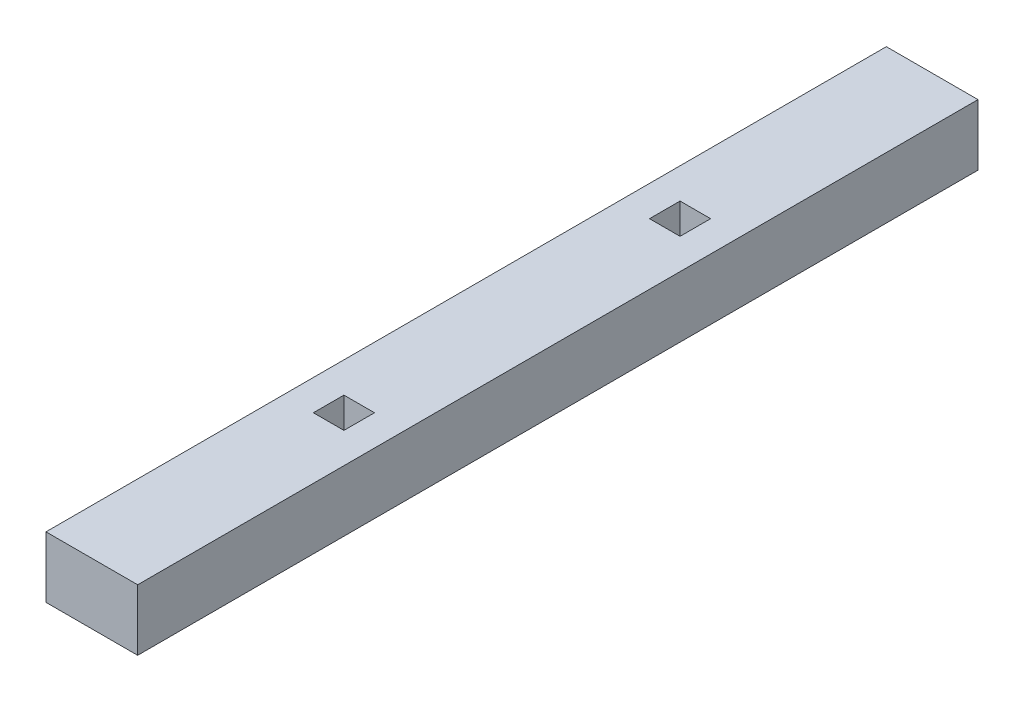
ISO-10303-21;
HEADER;
FILE_DESCRIPTION(('STEP AP214'),'2;1');
FILE_NAME('part.step','',(''),(''),'','','');
FILE_SCHEMA(('AUTOMOTIVE_DESIGN { 1 0 10303 214 1 1 1 1 }'));
ENDSEC;
DATA;
#1=APPLICATION_CONTEXT('core data for automotive mechanical design processes');
#2=APPLICATION_PROTOCOL_DEFINITION('international standard','automotive_design',2000,#1);
#3=PRODUCT_CONTEXT('',#1,'mechanical');
#4=PRODUCT('Part','Part','',(#3));
#5=PRODUCT_RELATED_PRODUCT_CATEGORY('part','',(#4));
#6=PRODUCT_DEFINITION_FORMATION('','',#4);
#7=PRODUCT_DEFINITION_CONTEXT('part definition',#1,'design');
#8=PRODUCT_DEFINITION('design','',#6,#7);
#9=PRODUCT_DEFINITION_SHAPE('','',#8);
#10=(LENGTH_UNIT() NAMED_UNIT(*) SI_UNIT(.MILLI.,.METRE.));
#11=(NAMED_UNIT(*) PLANE_ANGLE_UNIT() SI_UNIT($,.RADIAN.));
#12=(NAMED_UNIT(*) SI_UNIT($,.STERADIAN.) SOLID_ANGLE_UNIT());
#13=UNCERTAINTY_MEASURE_WITH_UNIT(LENGTH_MEASURE(1.E-05),#10,'distance_accuracy_value','');
#14=(GEOMETRIC_REPRESENTATION_CONTEXT(3) GLOBAL_UNCERTAINTY_ASSIGNED_CONTEXT((#13)) GLOBAL_UNIT_ASSIGNED_CONTEXT((#10,
#11,#12)) REPRESENTATION_CONTEXT('',''));
#15=CARTESIAN_POINT('',(0.,0.,0.));
#16=DIRECTION('',(0.,0.,1.));
#17=DIRECTION('',(1.,0.,0.));
#18=AXIS2_PLACEMENT_3D('',#15,#16,#17);
#19=CARTESIAN_POINT('',(0.,20.,0.));
#20=DIRECTION('',(0.,1.,0.));
#21=DIRECTION('',(0.,0.,1.));
#22=AXIS2_PLACEMENT_3D('',#19,#20,#21);
#23=PLANE('',#22);
#24=DIRECTION('',(0.,0.,1.));
#25=VECTOR('',#24,1.);
#26=CARTESIAN_POINT('',(-15.,20.,-132.5));
#27=LINE('',#26,#25);
#28=CARTESIAN_POINT('',(-15.,20.,-132.5));
#29=VERTEX_POINT('',#28);
#30=CARTESIAN_POINT('',(-15.,20.,142.5));
#31=VERTEX_POINT('',#30);
#32=EDGE_CURVE('E189',#29,#31,#27,.T.);
#33=ORIENTED_EDGE('',*,*,#32,.T.);
#34=DIRECTION('',(1.,0.,0.));
#35=VECTOR('',#34,1.);
#36=CARTESIAN_POINT('',(-15.,20.,142.5));
#37=LINE('',#36,#35);
#38=CARTESIAN_POINT('',(15.,20.,142.5));
#39=VERTEX_POINT('',#38);
#40=EDGE_CURVE('E192',#31,#39,#37,.T.);
#41=ORIENTED_EDGE('',*,*,#40,.T.);
#42=DIRECTION('',(0.,0.,-1.));
#43=VECTOR('',#42,1.);
#44=CARTESIAN_POINT('',(15.,20.,-132.5));
#45=LINE('',#44,#43);
#46=CARTESIAN_POINT('',(15.,20.,-132.5));
#47=VERTEX_POINT('',#46);
#48=EDGE_CURVE('E195',#39,#47,#45,.T.);
#49=ORIENTED_EDGE('',*,*,#48,.T.);
#50=DIRECTION('',(-1.,0.,0.));
#51=VECTOR('',#50,1.);
#52=CARTESIAN_POINT('',(-15.,20.,-132.5));
#53=LINE('',#52,#51);
#54=EDGE_CURVE('E197',#47,#29,#53,.T.);
#55=ORIENTED_EDGE('',*,*,#54,.T.);
#56=EDGE_LOOP('',(#33,#41,#49,#55));
#57=FACE_BOUND('',#56,.T.);
#58=DIRECTION('',(1.,0.,0.));
#59=VECTOR('',#58,1.);
#60=CARTESIAN_POINT('',(-5.,20.,-45.));
#61=LINE('',#60,#59);
#62=CARTESIAN_POINT('',(-5.,20.,-45.));
#63=VERTEX_POINT('',#62);
#64=CARTESIAN_POINT('',(5.,20.,-45.));
#65=VERTEX_POINT('',#64);
#66=EDGE_CURVE('E160',#63,#65,#61,.T.);
#67=ORIENTED_EDGE('',*,*,#66,.F.);
#68=DIRECTION('',(0.,0.,1.));
#69=VECTOR('',#68,1.);
#70=CARTESIAN_POINT('',(-5.,20.,-55.));
#71=LINE('',#70,#69);
#72=CARTESIAN_POINT('',(-5.,20.,-55.));
#73=VERTEX_POINT('',#72);
#74=EDGE_CURVE('E158',#73,#63,#71,.T.);
#75=ORIENTED_EDGE('',*,*,#74,.F.);
#76=DIRECTION('',(-1.,0.,0.));
#77=VECTOR('',#76,1.);
#78=CARTESIAN_POINT('',(-5.,20.,-55.));
#79=LINE('',#78,#77);
#80=CARTESIAN_POINT('',(5.,20.,-55.));
#81=VERTEX_POINT('',#80);
#82=EDGE_CURVE('E166',#81,#73,#79,.T.);
#83=ORIENTED_EDGE('',*,*,#82,.F.);
#84=DIRECTION('',(0.,0.,-1.));
#85=VECTOR('',#84,1.);
#86=CARTESIAN_POINT('',(5.,20.,-55.));
#87=LINE('',#86,#85);
#88=EDGE_CURVE('E163',#65,#81,#87,.T.);
#89=ORIENTED_EDGE('',*,*,#88,.F.);
#90=EDGE_LOOP('',(#67,#75,#83,#89));
#91=FACE_BOUND('',#90,.T.);
#92=DIRECTION('',(0.,0.,-1.));
#93=VECTOR('',#92,1.);
#94=CARTESIAN_POINT('',(5.,20.,65.));
#95=LINE('',#94,#93);
#96=CARTESIAN_POINT('',(5.,20.,65.));
#97=VERTEX_POINT('',#96);
#98=CARTESIAN_POINT('',(5.,20.,55.));
#99=VERTEX_POINT('',#98);
#100=EDGE_CURVE('E130',#97,#99,#95,.T.);
#101=ORIENTED_EDGE('',*,*,#100,.F.);
#102=DIRECTION('',(1.,0.,0.));
#103=VECTOR('',#102,1.);
#104=CARTESIAN_POINT('',(-5.,20.,65.));
#105=LINE('',#104,#103);
#106=CARTESIAN_POINT('',(-5.,20.,65.));
#107=VERTEX_POINT('',#106);
#108=EDGE_CURVE('E122',#107,#97,#105,.T.);
#109=ORIENTED_EDGE('',*,*,#108,.F.);
#110=DIRECTION('',(0.,0.,1.));
#111=VECTOR('',#110,1.);
#112=CARTESIAN_POINT('',(-5.,20.,65.));
#113=LINE('',#112,#111);
#114=CARTESIAN_POINT('',(-5.,20.,55.));
#115=VERTEX_POINT('',#114);
#116=EDGE_CURVE('E144',#115,#107,#113,.T.);
#117=ORIENTED_EDGE('',*,*,#116,.F.);
#118=DIRECTION('',(-1.,0.,0.));
#119=VECTOR('',#118,1.);
#120=CARTESIAN_POINT('',(-5.,20.,55.));
#121=LINE('',#120,#119);
#122=EDGE_CURVE('E142',#99,#115,#121,.T.);
#123=ORIENTED_EDGE('',*,*,#122,.F.);
#124=EDGE_LOOP('',(#101,#109,#117,#123));
#125=FACE_BOUND('',#124,.T.);
#126=ADVANCED_FACE('F33',(#57,#91,#125),#23,.T.);
#127=CARTESIAN_POINT('',(0.,0.,0.));
#128=DIRECTION('',(0.,1.,0.));
#129=DIRECTION('',(0.,0.,1.));
#130=AXIS2_PLACEMENT_3D('',#127,#128,#129);
#131=PLANE('',#130);
#132=DIRECTION('',(0.,0.,1.));
#133=VECTOR('',#132,1.);
#134=CARTESIAN_POINT('',(-5.,0.,-55.));
#135=LINE('',#134,#133);
#136=CARTESIAN_POINT('',(-5.,0.,-55.));
#137=VERTEX_POINT('',#136);
#138=CARTESIAN_POINT('',(-5.,0.,-45.));
#139=VERTEX_POINT('',#138);
#140=EDGE_CURVE('E138',#137,#139,#135,.T.);
#141=ORIENTED_EDGE('',*,*,#140,.T.);
#142=DIRECTION('',(1.,0.,0.));
#143=VECTOR('',#142,1.);
#144=CARTESIAN_POINT('',(-5.,0.,-45.));
#145=LINE('',#144,#143);
#146=CARTESIAN_POINT('',(5.,0.,-45.));
#147=VERTEX_POINT('',#146);
#148=EDGE_CURVE('E171',#139,#147,#145,.T.);
#149=ORIENTED_EDGE('',*,*,#148,.T.);
#150=DIRECTION('',(0.,0.,-1.));
#151=VECTOR('',#150,1.);
#152=CARTESIAN_POINT('',(5.,0.,-55.));
#153=LINE('',#152,#151);
#154=CARTESIAN_POINT('',(5.,0.,-55.));
#155=VERTEX_POINT('',#154);
#156=EDGE_CURVE('E174',#147,#155,#153,.T.);
#157=ORIENTED_EDGE('',*,*,#156,.T.);
#158=DIRECTION('',(-1.,0.,0.));
#159=VECTOR('',#158,1.);
#160=CARTESIAN_POINT('',(-5.,0.,-55.));
#161=LINE('',#160,#159);
#162=EDGE_CURVE('E161',#155,#137,#161,.T.);
#163=ORIENTED_EDGE('',*,*,#162,.T.);
#164=EDGE_LOOP('',(#141,#149,#157,#163));
#165=FACE_BOUND('',#164,.T.);
#166=DIRECTION('',(0.,0.,1.));
#167=VECTOR('',#166,1.);
#168=CARTESIAN_POINT('',(-15.,0.,-132.5));
#169=LINE('',#168,#167);
#170=CARTESIAN_POINT('',(-15.,0.,-132.5));
#171=VERTEX_POINT('',#170);
#172=CARTESIAN_POINT('',(-15.,0.,142.5));
#173=VERTEX_POINT('',#172);
#174=EDGE_CURVE('E188',#171,#173,#169,.T.);
#175=ORIENTED_EDGE('',*,*,#174,.F.);
#176=DIRECTION('',(-1.,0.,0.));
#177=VECTOR('',#176,1.);
#178=CARTESIAN_POINT('',(-15.,0.,-132.5));
#179=LINE('',#178,#177);
#180=CARTESIAN_POINT('',(15.,0.,-132.5));
#181=VERTEX_POINT('',#180);
#182=EDGE_CURVE('E193',#181,#171,#179,.T.);
#183=ORIENTED_EDGE('',*,*,#182,.F.);
#184=DIRECTION('',(0.,0.,-1.));
#185=VECTOR('',#184,1.);
#186=CARTESIAN_POINT('',(15.,0.,-132.5));
#187=LINE('',#186,#185);
#188=CARTESIAN_POINT('',(15.,0.,142.5));
#189=VERTEX_POINT('',#188);
#190=EDGE_CURVE('E204',#189,#181,#187,.T.);
#191=ORIENTED_EDGE('',*,*,#190,.F.);
#192=DIRECTION('',(1.,0.,0.));
#193=VECTOR('',#192,1.);
#194=CARTESIAN_POINT('',(-15.,0.,142.5));
#195=LINE('',#194,#193);
#196=EDGE_CURVE('E202',#173,#189,#195,.T.);
#197=ORIENTED_EDGE('',*,*,#196,.F.);
#198=EDGE_LOOP('',(#175,#183,#191,#197));
#199=FACE_BOUND('',#198,.T.);
#200=DIRECTION('',(1.,0.,0.));
#201=VECTOR('',#200,1.);
#202=CARTESIAN_POINT('',(-5.,0.,65.));
#203=LINE('',#202,#201);
#204=CARTESIAN_POINT('',(-5.,0.,65.));
#205=VERTEX_POINT('',#204);
#206=CARTESIAN_POINT('',(5.,0.,65.));
#207=VERTEX_POINT('',#206);
#208=EDGE_CURVE('E56',#205,#207,#203,.T.);
#209=ORIENTED_EDGE('',*,*,#208,.T.);
#210=DIRECTION('',(0.,0.,-1.));
#211=VECTOR('',#210,1.);
#212=CARTESIAN_POINT('',(5.,0.,65.));
#213=LINE('',#212,#211);
#214=CARTESIAN_POINT('',(5.,0.,55.));
#215=VERTEX_POINT('',#214);
#216=EDGE_CURVE('E137',#207,#215,#213,.T.);
#217=ORIENTED_EDGE('',*,*,#216,.T.);
#218=DIRECTION('',(-1.,0.,0.));
#219=VECTOR('',#218,1.);
#220=CARTESIAN_POINT('',(-5.,0.,55.));
#221=LINE('',#220,#219);
#222=CARTESIAN_POINT('',(-5.,0.,55.));
#223=VERTEX_POINT('',#222);
#224=EDGE_CURVE('E150',#215,#223,#221,.T.);
#225=ORIENTED_EDGE('',*,*,#224,.T.);
#226=DIRECTION('',(0.,0.,1.));
#227=VECTOR('',#226,1.);
#228=CARTESIAN_POINT('',(-5.,0.,65.));
#229=LINE('',#228,#227);
#230=EDGE_CURVE('E131',#223,#205,#229,.T.);
#231=ORIENTED_EDGE('',*,*,#230,.T.);
#232=EDGE_LOOP('',(#209,#217,#225,#231));
#233=FACE_BOUND('',#232,.T.);
#234=ADVANCED_FACE('F222',(#165,#199,#233),#131,.F.);
#235=CARTESIAN_POINT('',(-15.,20.,-132.5));
#236=DIRECTION('',(1.,0.,0.));
#237=DIRECTION('',(0.,0.,-1.));
#238=AXIS2_PLACEMENT_3D('',#235,#236,#237);
#239=PLANE('',#238);
#240=ORIENTED_EDGE('',*,*,#174,.T.);
#241=DIRECTION('',(0.,-1.,0.));
#242=VECTOR('',#241,1.);
#243=CARTESIAN_POINT('',(-15.,20.,142.5));
#244=LINE('',#243,#242);
#245=EDGE_CURVE('E11',#31,#173,#244,.T.);
#246=ORIENTED_EDGE('',*,*,#245,.F.);
#247=ORIENTED_EDGE('',*,*,#32,.F.);
#248=DIRECTION('',(0.,-1.,0.));
#249=VECTOR('',#248,1.);
#250=CARTESIAN_POINT('',(-15.,20.,-132.5));
#251=LINE('',#250,#249);
#252=EDGE_CURVE('E199',#29,#171,#251,.T.);
#253=ORIENTED_EDGE('',*,*,#252,.T.);
#254=EDGE_LOOP('',(#240,#246,#247,#253));
#255=FACE_BOUND('',#254,.T.);
#256=ADVANCED_FACE('F35',(#255),#239,.F.);
#257=CARTESIAN_POINT('',(-15.,20.,142.5));
#258=DIRECTION('',(0.,0.,-1.));
#259=DIRECTION('',(-1.,0.,0.));
#260=AXIS2_PLACEMENT_3D('',#257,#258,#259);
#261=PLANE('',#260);
#262=ORIENTED_EDGE('',*,*,#196,.T.);
#263=DIRECTION('',(0.,-1.,0.));
#264=VECTOR('',#263,1.);
#265=CARTESIAN_POINT('',(15.,20.,142.5));
#266=LINE('',#265,#264);
#267=EDGE_CURVE('E41',#39,#189,#266,.T.);
#268=ORIENTED_EDGE('',*,*,#267,.F.);
#269=ORIENTED_EDGE('',*,*,#40,.F.);
#270=ORIENTED_EDGE('',*,*,#245,.T.);
#271=EDGE_LOOP('',(#262,#268,#269,#270));
#272=FACE_BOUND('',#271,.T.);
#273=ADVANCED_FACE('F233',(#272),#261,.F.);
#274=CARTESIAN_POINT('',(15.,20.,-132.5));
#275=DIRECTION('',(-1.,0.,0.));
#276=DIRECTION('',(0.,0.,1.));
#277=AXIS2_PLACEMENT_3D('',#274,#275,#276);
#278=PLANE('',#277);
#279=ORIENTED_EDGE('',*,*,#190,.T.);
#280=DIRECTION('',(0.,-1.,0.));
#281=VECTOR('',#280,1.);
#282=CARTESIAN_POINT('',(15.,20.,-132.5));
#283=LINE('',#282,#281);
#284=EDGE_CURVE('E209',#47,#181,#283,.T.);
#285=ORIENTED_EDGE('',*,*,#284,.F.);
#286=ORIENTED_EDGE('',*,*,#48,.F.);
#287=ORIENTED_EDGE('',*,*,#267,.T.);
#288=EDGE_LOOP('',(#279,#285,#286,#287));
#289=FACE_BOUND('',#288,.T.);
#290=ADVANCED_FACE('F216',(#289),#278,.F.);
#291=CARTESIAN_POINT('',(-15.,20.,-132.5));
#292=DIRECTION('',(0.,0.,1.));
#293=DIRECTION('',(1.,0.,0.));
#294=AXIS2_PLACEMENT_3D('',#291,#292,#293);
#295=PLANE('',#294);
#296=ORIENTED_EDGE('',*,*,#182,.T.);
#297=ORIENTED_EDGE('',*,*,#252,.F.);
#298=ORIENTED_EDGE('',*,*,#54,.F.);
#299=ORIENTED_EDGE('',*,*,#284,.T.);
#300=EDGE_LOOP('',(#296,#297,#298,#299));
#301=FACE_BOUND('',#300,.T.);
#302=ADVANCED_FACE('F226',(#301),#295,.F.);
#303=CARTESIAN_POINT('',(-5.,20.,-55.));
#304=DIRECTION('',(1.,0.,0.));
#305=DIRECTION('',(0.,0.,-1.));
#306=AXIS2_PLACEMENT_3D('',#303,#304,#305);
#307=PLANE('',#306);
#308=ORIENTED_EDGE('',*,*,#140,.F.);
#309=DIRECTION('',(0.,-1.,0.));
#310=VECTOR('',#309,1.);
#311=CARTESIAN_POINT('',(-5.,20.,-55.));
#312=LINE('',#311,#310);
#313=EDGE_CURVE('E168',#73,#137,#312,.T.);
#314=ORIENTED_EDGE('',*,*,#313,.F.);
#315=ORIENTED_EDGE('',*,*,#74,.T.);
#316=DIRECTION('',(0.,-1.,0.));
#317=VECTOR('',#316,1.);
#318=CARTESIAN_POINT('',(-5.,20.,-45.));
#319=LINE('',#318,#317);
#320=EDGE_CURVE('E185',#63,#139,#319,.T.);
#321=ORIENTED_EDGE('',*,*,#320,.T.);
#322=EDGE_LOOP('',(#308,#314,#315,#321));
#323=FACE_BOUND('',#322,.T.);
#324=ADVANCED_FACE('F248',(#323),#307,.T.);
#325=CARTESIAN_POINT('',(-5.,20.,-45.));
#326=DIRECTION('',(0.,0.,-1.));
#327=DIRECTION('',(-1.,0.,0.));
#328=AXIS2_PLACEMENT_3D('',#325,#326,#327);
#329=PLANE('',#328);
#330=ORIENTED_EDGE('',*,*,#148,.F.);
#331=ORIENTED_EDGE('',*,*,#320,.F.);
#332=ORIENTED_EDGE('',*,*,#66,.T.);
#333=DIRECTION('',(0.,-1.,0.));
#334=VECTOR('',#333,1.);
#335=CARTESIAN_POINT('',(5.,20.,-45.));
#336=LINE('',#335,#334);
#337=EDGE_CURVE('E183',#65,#147,#336,.T.);
#338=ORIENTED_EDGE('',*,*,#337,.T.);
#339=EDGE_LOOP('',(#330,#331,#332,#338));
#340=FACE_BOUND('',#339,.T.);
#341=ADVANCED_FACE('F255',(#340),#329,.T.);
#342=CARTESIAN_POINT('',(5.,20.,-55.));
#343=DIRECTION('',(-1.,0.,0.));
#344=DIRECTION('',(0.,0.,1.));
#345=AXIS2_PLACEMENT_3D('',#342,#343,#344);
#346=PLANE('',#345);
#347=ORIENTED_EDGE('',*,*,#156,.F.);
#348=ORIENTED_EDGE('',*,*,#337,.F.);
#349=ORIENTED_EDGE('',*,*,#88,.T.);
#350=DIRECTION('',(0.,-1.,0.));
#351=VECTOR('',#350,1.);
#352=CARTESIAN_POINT('',(5.,20.,-55.));
#353=LINE('',#352,#351);
#354=EDGE_CURVE('E181',#81,#155,#353,.T.);
#355=ORIENTED_EDGE('',*,*,#354,.T.);
#356=EDGE_LOOP('',(#347,#348,#349,#355));
#357=FACE_BOUND('',#356,.T.);
#358=ADVANCED_FACE('F260',(#357),#346,.T.);
#359=CARTESIAN_POINT('',(-5.,20.,-55.));
#360=DIRECTION('',(0.,0.,1.));
#361=DIRECTION('',(1.,0.,0.));
#362=AXIS2_PLACEMENT_3D('',#359,#360,#361);
#363=PLANE('',#362);
#364=ORIENTED_EDGE('',*,*,#162,.F.);
#365=ORIENTED_EDGE('',*,*,#354,.F.);
#366=ORIENTED_EDGE('',*,*,#82,.T.);
#367=ORIENTED_EDGE('',*,*,#313,.T.);
#368=EDGE_LOOP('',(#364,#365,#366,#367));
#369=FACE_BOUND('',#368,.T.);
#370=ADVANCED_FACE('F267',(#369),#363,.T.);
#371=CARTESIAN_POINT('',(-5.,20.,65.));
#372=DIRECTION('',(0.,0.,-1.));
#373=DIRECTION('',(-1.,0.,0.));
#374=AXIS2_PLACEMENT_3D('',#371,#372,#373);
#375=PLANE('',#374);
#376=ORIENTED_EDGE('',*,*,#208,.F.);
#377=DIRECTION('',(0.,-1.,0.));
#378=VECTOR('',#377,1.);
#379=CARTESIAN_POINT('',(-5.,20.,65.));
#380=LINE('',#379,#378);
#381=EDGE_CURVE('E126',#107,#205,#380,.T.);
#382=ORIENTED_EDGE('',*,*,#381,.F.);
#383=ORIENTED_EDGE('',*,*,#108,.T.);
#384=DIRECTION('',(0.,-1.,0.));
#385=VECTOR('',#384,1.);
#386=CARTESIAN_POINT('',(5.,20.,65.));
#387=LINE('',#386,#385);
#388=EDGE_CURVE('E125',#97,#207,#387,.T.);
#389=ORIENTED_EDGE('',*,*,#388,.T.);
#390=EDGE_LOOP('',(#376,#382,#383,#389));
#391=FACE_BOUND('',#390,.T.);
#392=ADVANCED_FACE('F124',(#391),#375,.T.);
#393=CARTESIAN_POINT('',(5.,20.,65.));
#394=DIRECTION('',(-1.,0.,0.));
#395=DIRECTION('',(0.,0.,1.));
#396=AXIS2_PLACEMENT_3D('',#393,#394,#395);
#397=PLANE('',#396);
#398=ORIENTED_EDGE('',*,*,#216,.F.);
#399=ORIENTED_EDGE('',*,*,#388,.F.);
#400=ORIENTED_EDGE('',*,*,#100,.T.);
#401=DIRECTION('',(0.,-1.,0.));
#402=VECTOR('',#401,1.);
#403=CARTESIAN_POINT('',(5.,20.,55.));
#404=LINE('',#403,#402);
#405=EDGE_CURVE('E139',#99,#215,#404,.T.);
#406=ORIENTED_EDGE('',*,*,#405,.T.);
#407=EDGE_LOOP('',(#398,#399,#400,#406));
#408=FACE_BOUND('',#407,.T.);
#409=ADVANCED_FACE('F134',(#408),#397,.T.);
#410=CARTESIAN_POINT('',(-5.,20.,55.));
#411=DIRECTION('',(0.,0.,1.));
#412=DIRECTION('',(1.,0.,0.));
#413=AXIS2_PLACEMENT_3D('',#410,#411,#412);
#414=PLANE('',#413);
#415=ORIENTED_EDGE('',*,*,#224,.F.);
#416=ORIENTED_EDGE('',*,*,#405,.F.);
#417=ORIENTED_EDGE('',*,*,#122,.T.);
#418=DIRECTION('',(0.,-1.,0.));
#419=VECTOR('',#418,1.);
#420=CARTESIAN_POINT('',(-5.,20.,55.));
#421=LINE('',#420,#419);
#422=EDGE_CURVE('E48',#115,#223,#421,.T.);
#423=ORIENTED_EDGE('',*,*,#422,.T.);
#424=EDGE_LOOP('',(#415,#416,#417,#423));
#425=FACE_BOUND('',#424,.T.);
#426=ADVANCED_FACE('F285',(#425),#414,.T.);
#427=CARTESIAN_POINT('',(-5.,20.,65.));
#428=DIRECTION('',(1.,0.,0.));
#429=DIRECTION('',(0.,0.,-1.));
#430=AXIS2_PLACEMENT_3D('',#427,#428,#429);
#431=PLANE('',#430);
#432=ORIENTED_EDGE('',*,*,#230,.F.);
#433=ORIENTED_EDGE('',*,*,#422,.F.);
#434=ORIENTED_EDGE('',*,*,#116,.T.);
#435=ORIENTED_EDGE('',*,*,#381,.T.);
#436=EDGE_LOOP('',(#432,#433,#434,#435));
#437=FACE_BOUND('',#436,.T.);
#438=ADVANCED_FACE('F288',(#437),#431,.T.);
#439=CLOSED_SHELL('',(#126,#234,#256,#273,#290,#302,#324,#341,#358,#370,#392,#409,#426,#438));
#440=MANIFOLD_SOLID_BREP('B2',#439);
#441=ADVANCED_BREP_SHAPE_REPRESENTATION('',(#18,#440),#14);
#442=SHAPE_DEFINITION_REPRESENTATION(#9,#441);
ENDSEC;
END-ISO-10303-21;
